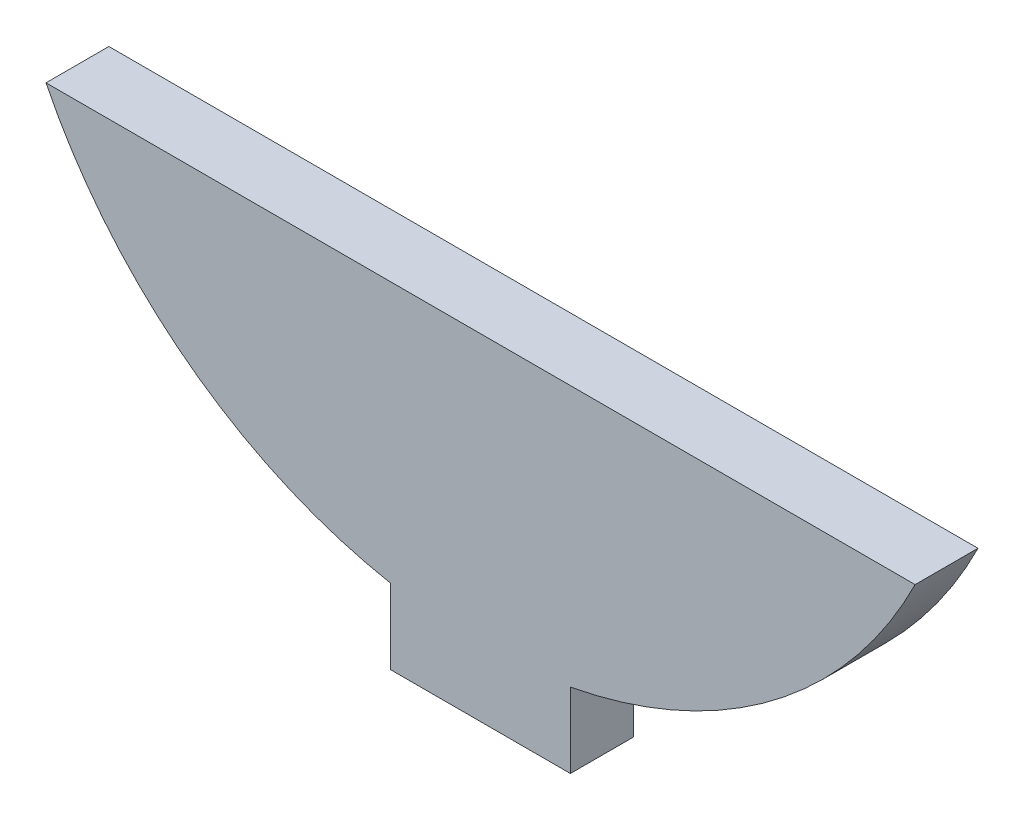
ISO-10303-21;
HEADER;
FILE_DESCRIPTION(('STEP AP214'),'2;1');
FILE_NAME('part.step','',(''),(''),'','','');
FILE_SCHEMA(('AUTOMOTIVE_DESIGN { 1 0 10303 214 1 1 1 1 }'));
ENDSEC;
DATA;
#1=APPLICATION_CONTEXT('core data for automotive mechanical design processes');
#2=APPLICATION_PROTOCOL_DEFINITION('international standard','automotive_design',2000,#1);
#3=PRODUCT_CONTEXT('',#1,'mechanical');
#4=PRODUCT('Part','Part','',(#3));
#5=PRODUCT_RELATED_PRODUCT_CATEGORY('part','',(#4));
#6=PRODUCT_DEFINITION_FORMATION('','',#4);
#7=PRODUCT_DEFINITION_CONTEXT('part definition',#1,'design');
#8=PRODUCT_DEFINITION('design','',#6,#7);
#9=PRODUCT_DEFINITION_SHAPE('','',#8);
#10=(LENGTH_UNIT() NAMED_UNIT(*) SI_UNIT(.MILLI.,.METRE.));
#11=(NAMED_UNIT(*) PLANE_ANGLE_UNIT() SI_UNIT($,.RADIAN.));
#12=(NAMED_UNIT(*) SI_UNIT($,.STERADIAN.) SOLID_ANGLE_UNIT());
#13=UNCERTAINTY_MEASURE_WITH_UNIT(LENGTH_MEASURE(1.E-05),#10,'distance_accuracy_value','');
#14=(GEOMETRIC_REPRESENTATION_CONTEXT(3) GLOBAL_UNCERTAINTY_ASSIGNED_CONTEXT((#13)) GLOBAL_UNIT_ASSIGNED_CONTEXT((#10,
#11,#12)) REPRESENTATION_CONTEXT('',''));
#15=CARTESIAN_POINT('',(0.,0.,0.));
#16=DIRECTION('',(0.,0.,1.));
#17=DIRECTION('',(1.,0.,0.));
#18=AXIS2_PLACEMENT_3D('',#15,#16,#17);
#19=CARTESIAN_POINT('',(0.,16.6164991614216,3.5));
#20=DIRECTION('',(0.,1.,0.));
#21=DIRECTION('',(0.,0.,1.));
#22=AXIS2_PLACEMENT_3D('',#19,#20,#21);
#23=PLANE('',#22);
#24=DIRECTION('',(1.,0.,0.));
#25=VECTOR('',#24,1.);
#26=CARTESIAN_POINT('',(0.,16.6164991614216,0.));
#27=LINE('',#26,#25);
#28=CARTESIAN_POINT('',(-24.1867732448956,16.6164991614216,0.));
#29=VERTEX_POINT('',#28);
#30=CARTESIAN_POINT('',(24.1867732448956,16.6164991614216,0.));
#31=VERTEX_POINT('',#30);
#32=EDGE_CURVE('E122',#29,#31,#27,.T.);
#33=ORIENTED_EDGE('',*,*,#32,.F.);
#34=DIRECTION('',(0.,0.,-1.));
#35=VECTOR('',#34,1.);
#36=CARTESIAN_POINT('',(-24.1867732448956,16.6164991614216,3.5));
#37=LINE('',#36,#35);
#38=CARTESIAN_POINT('',(-24.1867732448956,16.6164991614216,3.5));
#39=VERTEX_POINT('',#38);
#40=EDGE_CURVE('E11',#39,#29,#37,.T.);
#41=ORIENTED_EDGE('',*,*,#40,.F.);
#42=DIRECTION('',(1.,0.,0.));
#43=VECTOR('',#42,1.);
#44=CARTESIAN_POINT('',(0.,16.6164991614216,3.5));
#45=LINE('',#44,#43);
#46=CARTESIAN_POINT('',(24.1867732448956,16.6164991614216,3.5));
#47=VERTEX_POINT('',#46);
#48=EDGE_CURVE('E147',#39,#47,#45,.T.);
#49=ORIENTED_EDGE('',*,*,#48,.T.);
#50=DIRECTION('',(0.,0.,-1.));
#51=VECTOR('',#50,1.);
#52=CARTESIAN_POINT('',(24.1867732448956,16.6164991614216,3.5));
#53=LINE('',#52,#51);
#54=EDGE_CURVE('E85',#47,#31,#53,.T.);
#55=ORIENTED_EDGE('',*,*,#54,.T.);
#56=EDGE_LOOP('',(#33,#41,#49,#55));
#57=FACE_BOUND('',#56,.T.);
#58=ADVANCED_FACE('F41',(#57),#23,.T.);
#59=CARTESIAN_POINT('',(0.,28.6164991614216,3.5));
#60=DIRECTION('',(0.,0.,-1.));
#61=DIRECTION('',(-1.,0.,0.));
#62=AXIS2_PLACEMENT_3D('',#59,#60,#61);
#63=CYLINDRICAL_SURFACE('',#62,27.);
#64=CARTESIAN_POINT('',(0.,28.6164991614216,0.));
#65=DIRECTION('',(0.,0.,1.));
#66=DIRECTION('',(1.,0.,0.));
#67=AXIS2_PLACEMENT_3D('',#64,#65,#66);
#68=CIRCLE('',#67,27.);
#69=CARTESIAN_POINT('',(-5.,2.0835008385784,0.));
#70=VERTEX_POINT('',#69);
#71=EDGE_CURVE('E125',#29,#70,#68,.T.);
#72=ORIENTED_EDGE('',*,*,#71,.T.);
#73=DIRECTION('',(0.,0.,-1.));
#74=VECTOR('',#73,1.);
#75=CARTESIAN_POINT('',(-5.,2.0835008385784,3.5));
#76=LINE('',#75,#74);
#77=CARTESIAN_POINT('',(-5.,2.0835008385784,3.5));
#78=VERTEX_POINT('',#77);
#79=EDGE_CURVE('E49',#78,#70,#76,.T.);
#80=ORIENTED_EDGE('',*,*,#79,.F.);
#81=CARTESIAN_POINT('',(0.,28.6164991614216,3.5));
#82=DIRECTION('',(0.,0.,1.));
#83=DIRECTION('',(1.,0.,0.));
#84=AXIS2_PLACEMENT_3D('',#81,#82,#83);
#85=CIRCLE('',#84,27.);
#86=EDGE_CURVE('E118',#39,#78,#85,.T.);
#87=ORIENTED_EDGE('',*,*,#86,.F.);
#88=ORIENTED_EDGE('',*,*,#40,.T.);
#89=EDGE_LOOP('',(#72,#80,#87,#88));
#90=FACE_BOUND('',#89,.T.);
#91=ADVANCED_FACE('F142',(#90),#63,.T.);
#92=CARTESIAN_POINT('',(-5.,0.,3.5));
#93=DIRECTION('',(-1.,0.,0.));
#94=DIRECTION('',(0.,-1.,0.));
#95=AXIS2_PLACEMENT_3D('',#92,#93,#94);
#96=PLANE('',#95);
#97=DIRECTION('',(0.,1.,0.));
#98=VECTOR('',#97,1.);
#99=CARTESIAN_POINT('',(-5.,0.,0.));
#100=LINE('',#99,#98);
#101=CARTESIAN_POINT('',(-5.,-2.0835008385784,0.));
#102=VERTEX_POINT('',#101);
#103=EDGE_CURVE('E128',#102,#70,#100,.T.);
#104=ORIENTED_EDGE('',*,*,#103,.F.);
#105=DIRECTION('',(0.,0.,-1.));
#106=VECTOR('',#105,1.);
#107=CARTESIAN_POINT('',(-5.,-2.0835008385784,3.5));
#108=LINE('',#107,#106);
#109=CARTESIAN_POINT('',(-5.,-2.0835008385784,3.5));
#110=VERTEX_POINT('',#109);
#111=EDGE_CURVE('E107',#110,#102,#108,.T.);
#112=ORIENTED_EDGE('',*,*,#111,.F.);
#113=DIRECTION('',(0.,1.,0.));
#114=VECTOR('',#113,1.);
#115=CARTESIAN_POINT('',(-5.,0.,3.5));
#116=LINE('',#115,#114);
#117=EDGE_CURVE('E116',#110,#78,#116,.T.);
#118=ORIENTED_EDGE('',*,*,#117,.T.);
#119=ORIENTED_EDGE('',*,*,#79,.T.);
#120=EDGE_LOOP('',(#104,#112,#118,#119));
#121=FACE_BOUND('',#120,.T.);
#122=ADVANCED_FACE('F139',(#121),#96,.T.);
#123=CARTESIAN_POINT('',(0.,-2.0835008385784,3.5));
#124=DIRECTION('',(0.,-1.,0.));
#125=DIRECTION('',(0.,0.,-1.));
#126=AXIS2_PLACEMENT_3D('',#123,#124,#125);
#127=PLANE('',#126);
#128=DIRECTION('',(-1.,0.,0.));
#129=VECTOR('',#128,1.);
#130=CARTESIAN_POINT('',(0.,-2.0835008385784,0.));
#131=LINE('',#130,#129);
#132=CARTESIAN_POINT('',(5.,-2.0835008385784,0.));
#133=VERTEX_POINT('',#132);
#134=EDGE_CURVE('E106',#133,#102,#131,.T.);
#135=ORIENTED_EDGE('',*,*,#134,.F.);
#136=DIRECTION('',(0.,0.,-1.));
#137=VECTOR('',#136,1.);
#138=CARTESIAN_POINT('',(5.,-2.0835008385784,3.5));
#139=LINE('',#138,#137);
#140=CARTESIAN_POINT('',(5.,-2.0835008385784,3.5));
#141=VERTEX_POINT('',#140);
#142=EDGE_CURVE('E100',#141,#133,#139,.T.);
#143=ORIENTED_EDGE('',*,*,#142,.F.);
#144=DIRECTION('',(-1.,0.,0.));
#145=VECTOR('',#144,1.);
#146=CARTESIAN_POINT('',(0.,-2.0835008385784,3.5));
#147=LINE('',#146,#145);
#148=EDGE_CURVE('E104',#141,#110,#147,.T.);
#149=ORIENTED_EDGE('',*,*,#148,.T.);
#150=ORIENTED_EDGE('',*,*,#111,.T.);
#151=EDGE_LOOP('',(#135,#143,#149,#150));
#152=FACE_BOUND('',#151,.T.);
#153=ADVANCED_FACE('F102',(#152),#127,.T.);
#154=CARTESIAN_POINT('',(5.,0.,3.5));
#155=DIRECTION('',(-1.,0.,0.));
#156=DIRECTION('',(0.,-1.,0.));
#157=AXIS2_PLACEMENT_3D('',#154,#155,#156);
#158=PLANE('',#157);
#159=DIRECTION('',(0.,1.,0.));
#160=VECTOR('',#159,1.);
#161=CARTESIAN_POINT('',(5.,0.,0.));
#162=LINE('',#161,#160);
#163=CARTESIAN_POINT('',(5.,2.0835008385784,0.));
#164=VERTEX_POINT('',#163);
#165=EDGE_CURVE('E78',#133,#164,#162,.T.);
#166=ORIENTED_EDGE('',*,*,#165,.T.);
#167=DIRECTION('',(0.,0.,-1.));
#168=VECTOR('',#167,1.);
#169=CARTESIAN_POINT('',(5.,2.0835008385784,3.5));
#170=LINE('',#169,#168);
#171=CARTESIAN_POINT('',(5.,2.0835008385784,3.5));
#172=VERTEX_POINT('',#171);
#173=EDGE_CURVE('E108',#172,#164,#170,.T.);
#174=ORIENTED_EDGE('',*,*,#173,.F.);
#175=DIRECTION('',(0.,1.,0.));
#176=VECTOR('',#175,1.);
#177=CARTESIAN_POINT('',(5.,0.,3.5));
#178=LINE('',#177,#176);
#179=EDGE_CURVE('E110',#141,#172,#178,.T.);
#180=ORIENTED_EDGE('',*,*,#179,.F.);
#181=ORIENTED_EDGE('',*,*,#142,.T.);
#182=EDGE_LOOP('',(#166,#174,#180,#181));
#183=FACE_BOUND('',#182,.T.);
#184=ADVANCED_FACE('F111',(#183),#158,.F.);
#185=EDGE_CURVE('E129',#164,#31,#68,.T.);
#186=ORIENTED_EDGE('',*,*,#185,.T.);
#187=ORIENTED_EDGE('',*,*,#54,.F.);
#188=EDGE_CURVE('E57',#172,#47,#85,.T.);
#189=ORIENTED_EDGE('',*,*,#188,.F.);
#190=ORIENTED_EDGE('',*,*,#173,.T.);
#191=EDGE_LOOP('',(#186,#187,#189,#190));
#192=FACE_BOUND('',#191,.T.);
#193=ADVANCED_FACE('F154',(#192),#63,.T.);
#194=CARTESIAN_POINT('',(0.,0.,3.5));
#195=DIRECTION('',(0.,0.,1.));
#196=DIRECTION('',(1.,0.,0.));
#197=AXIS2_PLACEMENT_3D('',#194,#195,#196);
#198=PLANE('',#197);
#199=ORIENTED_EDGE('',*,*,#48,.F.);
#200=ORIENTED_EDGE('',*,*,#86,.T.);
#201=ORIENTED_EDGE('',*,*,#117,.F.);
#202=ORIENTED_EDGE('',*,*,#148,.F.);
#203=ORIENTED_EDGE('',*,*,#179,.T.);
#204=ORIENTED_EDGE('',*,*,#188,.T.);
#205=EDGE_LOOP('',(#199,#200,#201,#202,#203,#204));
#206=FACE_BOUND('',#205,.T.);
#207=ADVANCED_FACE('F114',(#206),#198,.T.);
#208=CARTESIAN_POINT('',(0.,0.,0.));
#209=DIRECTION('',(0.,0.,1.));
#210=DIRECTION('',(1.,0.,0.));
#211=AXIS2_PLACEMENT_3D('',#208,#209,#210);
#212=PLANE('',#211);
#213=ORIENTED_EDGE('',*,*,#32,.T.);
#214=ORIENTED_EDGE('',*,*,#185,.F.);
#215=ORIENTED_EDGE('',*,*,#165,.F.);
#216=ORIENTED_EDGE('',*,*,#134,.T.);
#217=ORIENTED_EDGE('',*,*,#103,.T.);
#218=ORIENTED_EDGE('',*,*,#71,.F.);
#219=EDGE_LOOP('',(#213,#214,#215,#216,#217,#218));
#220=FACE_BOUND('',#219,.T.);
#221=ADVANCED_FACE('F144',(#220),#212,.F.);
#222=CLOSED_SHELL('',(#58,#91,#122,#153,#184,#193,#207,#221));
#223=MANIFOLD_SOLID_BREP('B2',#222);
#224=ADVANCED_BREP_SHAPE_REPRESENTATION('',(#18,#223),#14);
#225=SHAPE_DEFINITION_REPRESENTATION(#9,#224);
ENDSEC;
END-ISO-10303-21;
